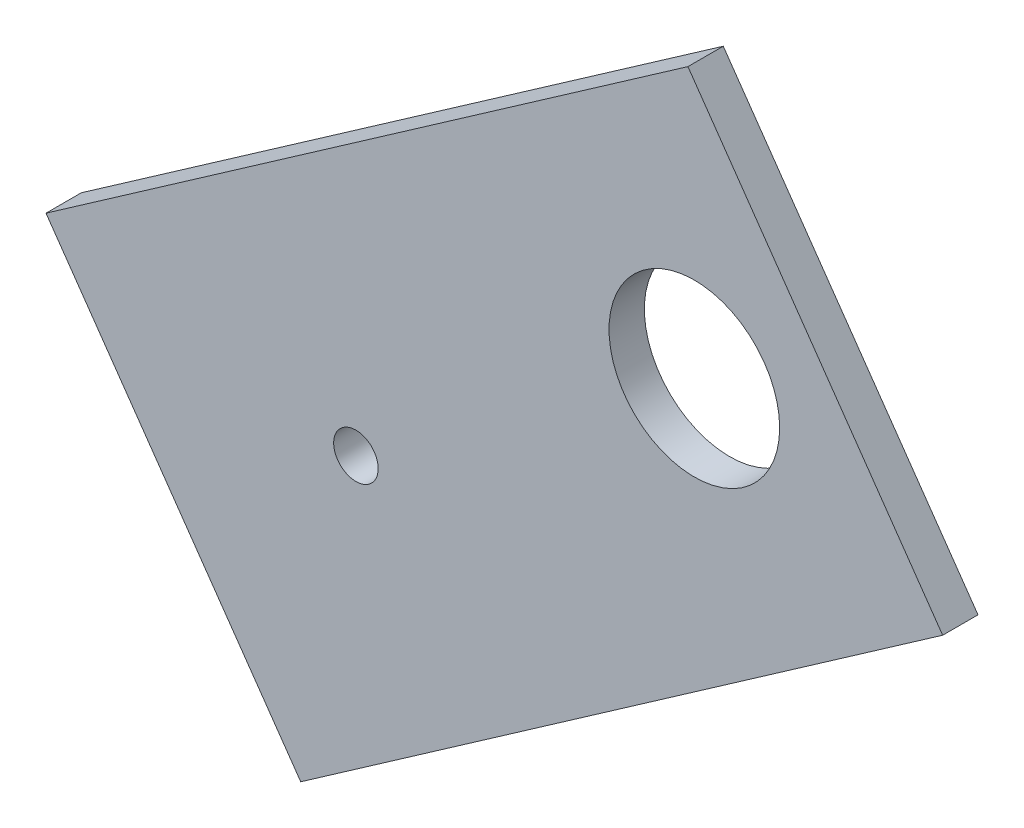
ISO-10303-21;
HEADER;
FILE_DESCRIPTION(('STEP AP214'),'2;1');
FILE_NAME('part.step','',(''),(''),'','','');
FILE_SCHEMA(('AUTOMOTIVE_DESIGN { 1 0 10303 214 1 1 1 1 }'));
ENDSEC;
DATA;
#1=APPLICATION_CONTEXT('core data for automotive mechanical design processes');
#2=APPLICATION_PROTOCOL_DEFINITION('international standard','automotive_design',2000,#1);
#3=PRODUCT_CONTEXT('',#1,'mechanical');
#4=PRODUCT('Part','Part','',(#3));
#5=PRODUCT_RELATED_PRODUCT_CATEGORY('part','',(#4));
#6=PRODUCT_DEFINITION_FORMATION('','',#4);
#7=PRODUCT_DEFINITION_CONTEXT('part definition',#1,'design');
#8=PRODUCT_DEFINITION('design','',#6,#7);
#9=PRODUCT_DEFINITION_SHAPE('','',#8);
#10=(LENGTH_UNIT() NAMED_UNIT(*) SI_UNIT(.MILLI.,.METRE.));
#11=(NAMED_UNIT(*) PLANE_ANGLE_UNIT() SI_UNIT($,.RADIAN.));
#12=(NAMED_UNIT(*) SI_UNIT($,.STERADIAN.) SOLID_ANGLE_UNIT());
#13=UNCERTAINTY_MEASURE_WITH_UNIT(LENGTH_MEASURE(1.E-05),#10,'distance_accuracy_value','');
#14=(GEOMETRIC_REPRESENTATION_CONTEXT(3) GLOBAL_UNCERTAINTY_ASSIGNED_CONTEXT((#13)) GLOBAL_UNIT_ASSIGNED_CONTEXT((#10,
#11,#12)) REPRESENTATION_CONTEXT('',''));
#15=CARTESIAN_POINT('',(0.,0.,0.));
#16=DIRECTION('',(0.,0.,1.));
#17=DIRECTION('',(1.,0.,0.));
#18=AXIS2_PLACEMENT_3D('',#15,#16,#17);
#19=CARTESIAN_POINT('',(56.2685478848419,15.9477071068351,4.7625));
#20=DIRECTION('',(0.,0.,-1.));
#21=DIRECTION('',(-1.,0.,0.));
#22=AXIS2_PLACEMENT_3D('',#19,#20,#21);
#23=PLANE('',#22);
#24=CARTESIAN_POINT('',(-22.8117586450123,-2.64680611698764,4.7625));
#25=DIRECTION('',(0.,0.,1.));
#26=DIRECTION('',(1.,0.,0.));
#27=AXIS2_PLACEMENT_3D('',#24,#25,#26);
#28=CIRCLE('',#27,3.);
#29=CARTESIAN_POINT('',(-19.8117586450123,-2.64680611698764,4.7625));
#30=VERTEX_POINT('',#29);
#31=EDGE_CURVE('E84',#30,#30,#28,.T.);
#32=ORIENTED_EDGE('',*,*,#31,.F.);
#33=EDGE_LOOP('',(#32));
#34=FACE_BOUND('',#33,.T.);
#35=DIRECTION('',(-0.572198602357161,0.820115089155487,0.));
#36=VECTOR('',#35,1.);
#37=CARTESIAN_POINT('',(21.9366317434122,65.1546124561644,4.7625));
#38=LINE('',#37,#36);
#39=CARTESIAN_POINT('',(56.2685478848419,15.9477071068351,4.7625));
#40=VERTEX_POINT('',#39);
#41=CARTESIAN_POINT('',(21.9366317434122,65.1546124561644,4.7625));
#42=VERTEX_POINT('',#41);
#43=EDGE_CURVE('E69',#40,#42,#38,.T.);
#44=ORIENTED_EDGE('',*,*,#43,.T.);
#45=DIRECTION('',(-0.820115089155487,-0.57219860235716,0.));
#46=VECTOR('',#45,1.);
#47=CARTESIAN_POINT('',(21.9366317434122,65.1546124561644,4.7625));
#48=LINE('',#47,#46);
#49=CARTESIAN_POINT('',(-64.5811693903917,4.79068848696215,4.7625));
#50=VERTEX_POINT('',#49);
#51=EDGE_CURVE('E64',#42,#50,#48,.T.);
#52=ORIENTED_EDGE('',*,*,#51,.T.);
#53=DIRECTION('',(0.572198602357158,-0.820115089155489,0.));
#54=VECTOR('',#53,1.);
#55=CARTESIAN_POINT('',(-64.5811693903917,4.79068848696215,4.7625));
#56=LINE('',#55,#54);
#57=CARTESIAN_POINT('',(-30.2492532489621,-44.4162168623672,4.7625));
#58=VERTEX_POINT('',#57);
#59=EDGE_CURVE('E67',#50,#58,#56,.T.);
#60=ORIENTED_EDGE('',*,*,#59,.T.);
#61=DIRECTION('',(0.820115089155487,0.572198602357161,0.));
#62=VECTOR('',#61,1.);
#63=CARTESIAN_POINT('',(56.2685478848419,15.9477071068351,4.7625));
#64=LINE('',#63,#62);
#65=EDGE_CURVE('E34',#58,#40,#64,.T.);
#66=ORIENTED_EDGE('',*,*,#65,.T.);
#67=EDGE_LOOP('',(#44,#52,#60,#66));
#68=FACE_BOUND('',#67,.T.);
#69=CARTESIAN_POINT('',(22.8000259739106,29.1767754206218,4.7625));
#70=DIRECTION('',(0.,0.,1.));
#71=DIRECTION('',(1.,0.,0.));
#72=AXIS2_PLACEMENT_3D('',#69,#70,#71);
#73=CIRCLE('',#72,11.5);
#74=CARTESIAN_POINT('',(34.3000259739106,29.1767754206218,4.7625));
#75=VERTEX_POINT('',#74);
#76=EDGE_CURVE('E99',#75,#75,#73,.T.);
#77=ORIENTED_EDGE('',*,*,#76,.F.);
#78=EDGE_LOOP('',(#77));
#79=FACE_BOUND('',#78,.T.);
#80=ADVANCED_FACE('F17',(#34,#68,#79),#23,.F.);
#81=CARTESIAN_POINT('',(56.2685478848419,15.9477071068351,0.));
#82=DIRECTION('',(0.,0.,-1.));
#83=DIRECTION('',(-1.,0.,0.));
#84=AXIS2_PLACEMENT_3D('',#81,#82,#83);
#85=PLANE('',#84);
#86=CARTESIAN_POINT('',(-22.8117586450123,-2.64680611698764,0.));
#87=DIRECTION('',(0.,0.,1.));
#88=DIRECTION('',(1.,0.,0.));
#89=AXIS2_PLACEMENT_3D('',#86,#87,#88);
#90=CIRCLE('',#89,3.);
#91=CARTESIAN_POINT('',(-19.8117586450123,-2.64680611698764,0.));
#92=VERTEX_POINT('',#91);
#93=EDGE_CURVE('E96',#92,#92,#90,.T.);
#94=ORIENTED_EDGE('',*,*,#93,.T.);
#95=EDGE_LOOP('',(#94));
#96=FACE_BOUND('',#95,.T.);
#97=DIRECTION('',(-0.572198602357161,0.820115089155487,0.));
#98=VECTOR('',#97,1.);
#99=CARTESIAN_POINT('',(21.9366317434122,65.1546124561644,0.));
#100=LINE('',#99,#98);
#101=CARTESIAN_POINT('',(56.2685478848419,15.9477071068351,0.));
#102=VERTEX_POINT('',#101);
#103=CARTESIAN_POINT('',(21.9366317434122,65.1546124561644,0.));
#104=VERTEX_POINT('',#103);
#105=EDGE_CURVE('E81',#102,#104,#100,.T.);
#106=ORIENTED_EDGE('',*,*,#105,.F.);
#107=DIRECTION('',(0.820115089155487,0.572198602357161,0.));
#108=VECTOR('',#107,1.);
#109=CARTESIAN_POINT('',(56.2685478848419,15.9477071068351,0.));
#110=LINE('',#109,#108);
#111=CARTESIAN_POINT('',(-30.2492532489621,-44.4162168623672,0.));
#112=VERTEX_POINT('',#111);
#113=EDGE_CURVE('E57',#112,#102,#110,.T.);
#114=ORIENTED_EDGE('',*,*,#113,.F.);
#115=DIRECTION('',(0.572198602357158,-0.820115089155489,0.));
#116=VECTOR('',#115,1.);
#117=CARTESIAN_POINT('',(-64.5811693903917,4.79068848696215,0.));
#118=LINE('',#117,#116);
#119=CARTESIAN_POINT('',(-64.5811693903917,4.79068848696215,0.));
#120=VERTEX_POINT('',#119);
#121=EDGE_CURVE('E51',#120,#112,#118,.T.);
#122=ORIENTED_EDGE('',*,*,#121,.F.);
#123=DIRECTION('',(-0.820115089155487,-0.57219860235716,0.));
#124=VECTOR('',#123,1.);
#125=CARTESIAN_POINT('',(21.9366317434122,65.1546124561644,0.));
#126=LINE('',#125,#124);
#127=EDGE_CURVE('E73',#104,#120,#126,.T.);
#128=ORIENTED_EDGE('',*,*,#127,.F.);
#129=EDGE_LOOP('',(#106,#114,#122,#128));
#130=FACE_BOUND('',#129,.T.);
#131=CARTESIAN_POINT('',(22.8000259739106,29.1767754206218,0.));
#132=DIRECTION('',(0.,0.,1.));
#133=DIRECTION('',(1.,0.,0.));
#134=AXIS2_PLACEMENT_3D('',#131,#132,#133);
#135=CIRCLE('',#134,11.5);
#136=CARTESIAN_POINT('',(34.3000259739106,29.1767754206218,0.));
#137=VERTEX_POINT('',#136);
#138=EDGE_CURVE('E102',#137,#137,#135,.T.);
#139=ORIENTED_EDGE('',*,*,#138,.T.);
#140=EDGE_LOOP('',(#139));
#141=FACE_BOUND('',#140,.T.);
#142=ADVANCED_FACE('F92',(#96,#130,#141),#85,.T.);
#143=CARTESIAN_POINT('',(21.9366317434122,65.1546124561644,4.7625));
#144=DIRECTION('',(-0.820115089155487,-0.572198602357161,0.));
#145=DIRECTION('',(0.572198602357161,-0.820115089155487,0.));
#146=AXIS2_PLACEMENT_3D('',#143,#144,#145);
#147=PLANE('',#146);
#148=ORIENTED_EDGE('',*,*,#105,.T.);
#149=DIRECTION('',(0.,0.,-1.));
#150=VECTOR('',#149,1.);
#151=CARTESIAN_POINT('',(21.9366317434122,65.1546124561644,4.7625));
#152=LINE('',#151,#150);
#153=EDGE_CURVE('E11',#42,#104,#152,.T.);
#154=ORIENTED_EDGE('',*,*,#153,.F.);
#155=ORIENTED_EDGE('',*,*,#43,.F.);
#156=DIRECTION('',(0.,0.,-1.));
#157=VECTOR('',#156,1.);
#158=CARTESIAN_POINT('',(56.2685478848419,15.9477071068351,4.7625));
#159=LINE('',#158,#157);
#160=EDGE_CURVE('E77',#40,#102,#159,.T.);
#161=ORIENTED_EDGE('',*,*,#160,.T.);
#162=EDGE_LOOP('',(#148,#154,#155,#161));
#163=FACE_BOUND('',#162,.T.);
#164=ADVANCED_FACE('F19',(#163),#147,.F.);
#165=CARTESIAN_POINT('',(21.9366317434122,65.1546124561644,4.7625));
#166=DIRECTION('',(0.57219860235716,-0.820115089155487,0.));
#167=DIRECTION('',(0.820115089155487,0.57219860235716,0.));
#168=AXIS2_PLACEMENT_3D('',#165,#166,#167);
#169=PLANE('',#168);
#170=ORIENTED_EDGE('',*,*,#127,.T.);
#171=DIRECTION('',(0.,0.,-1.));
#172=VECTOR('',#171,1.);
#173=CARTESIAN_POINT('',(-64.5811693903917,4.79068848696215,4.7625));
#174=LINE('',#173,#172);
#175=EDGE_CURVE('E26',#50,#120,#174,.T.);
#176=ORIENTED_EDGE('',*,*,#175,.F.);
#177=ORIENTED_EDGE('',*,*,#51,.F.);
#178=ORIENTED_EDGE('',*,*,#153,.T.);
#179=EDGE_LOOP('',(#170,#176,#177,#178));
#180=FACE_BOUND('',#179,.T.);
#181=ADVANCED_FACE('F72',(#180),#169,.F.);
#182=CARTESIAN_POINT('',(-64.5811693903917,4.79068848696215,4.7625));
#183=DIRECTION('',(0.820115089155489,0.572198602357158,0.));
#184=DIRECTION('',(-0.572198602357158,0.820115089155489,0.));
#185=AXIS2_PLACEMENT_3D('',#182,#183,#184);
#186=PLANE('',#185);
#187=ORIENTED_EDGE('',*,*,#121,.T.);
#188=DIRECTION('',(0.,0.,-1.));
#189=VECTOR('',#188,1.);
#190=CARTESIAN_POINT('',(-30.2492532489621,-44.4162168623672,4.7625));
#191=LINE('',#190,#189);
#192=EDGE_CURVE('E74',#58,#112,#191,.T.);
#193=ORIENTED_EDGE('',*,*,#192,.F.);
#194=ORIENTED_EDGE('',*,*,#59,.F.);
#195=ORIENTED_EDGE('',*,*,#175,.T.);
#196=EDGE_LOOP('',(#187,#193,#194,#195));
#197=FACE_BOUND('',#196,.T.);
#198=ADVANCED_FACE('F75',(#197),#186,.F.);
#199=CARTESIAN_POINT('',(56.2685478848419,15.9477071068351,4.7625));
#200=DIRECTION('',(-0.572198602357161,0.820115089155487,0.));
#201=DIRECTION('',(-0.820115089155487,-0.572198602357161,0.));
#202=AXIS2_PLACEMENT_3D('',#199,#200,#201);
#203=PLANE('',#202);
#204=ORIENTED_EDGE('',*,*,#113,.T.);
#205=ORIENTED_EDGE('',*,*,#160,.F.);
#206=ORIENTED_EDGE('',*,*,#65,.F.);
#207=ORIENTED_EDGE('',*,*,#192,.T.);
#208=EDGE_LOOP('',(#204,#205,#206,#207));
#209=FACE_BOUND('',#208,.T.);
#210=ADVANCED_FACE('F89',(#209),#203,.F.);
#211=CARTESIAN_POINT('',(-22.8117586450123,-2.64680611698764,4.7625));
#212=DIRECTION('',(0.,0.,-1.));
#213=DIRECTION('',(-1.,0.,0.));
#214=AXIS2_PLACEMENT_3D('',#211,#212,#213);
#215=CYLINDRICAL_SURFACE('',#214,3.);
#216=ORIENTED_EDGE('',*,*,#31,.T.);
#217=EDGE_LOOP('',(#216));
#218=FACE_BOUND('',#217,.T.);
#219=ORIENTED_EDGE('',*,*,#93,.F.);
#220=EDGE_LOOP('',(#219));
#221=FACE_BOUND('',#220,.T.);
#222=ADVANCED_FACE('F122',(#218,#221),#215,.F.);
#223=CARTESIAN_POINT('',(22.8000259739106,29.1767754206218,4.7625));
#224=DIRECTION('',(0.,0.,-1.));
#225=DIRECTION('',(-1.,0.,0.));
#226=AXIS2_PLACEMENT_3D('',#223,#224,#225);
#227=CYLINDRICAL_SURFACE('',#226,11.5);
#228=ORIENTED_EDGE('',*,*,#76,.T.);
#229=EDGE_LOOP('',(#228));
#230=FACE_BOUND('',#229,.T.);
#231=ORIENTED_EDGE('',*,*,#138,.F.);
#232=EDGE_LOOP('',(#231));
#233=FACE_BOUND('',#232,.T.);
#234=ADVANCED_FACE('F108',(#230,#233),#227,.F.);
#235=CLOSED_SHELL('',(#80,#142,#164,#181,#198,#210,#222,#234));
#236=MANIFOLD_SOLID_BREP('B1',#235);
#237=ADVANCED_BREP_SHAPE_REPRESENTATION('',(#18,#236),#14);
#238=SHAPE_DEFINITION_REPRESENTATION(#9,#237);
ENDSEC;
END-ISO-10303-21;
